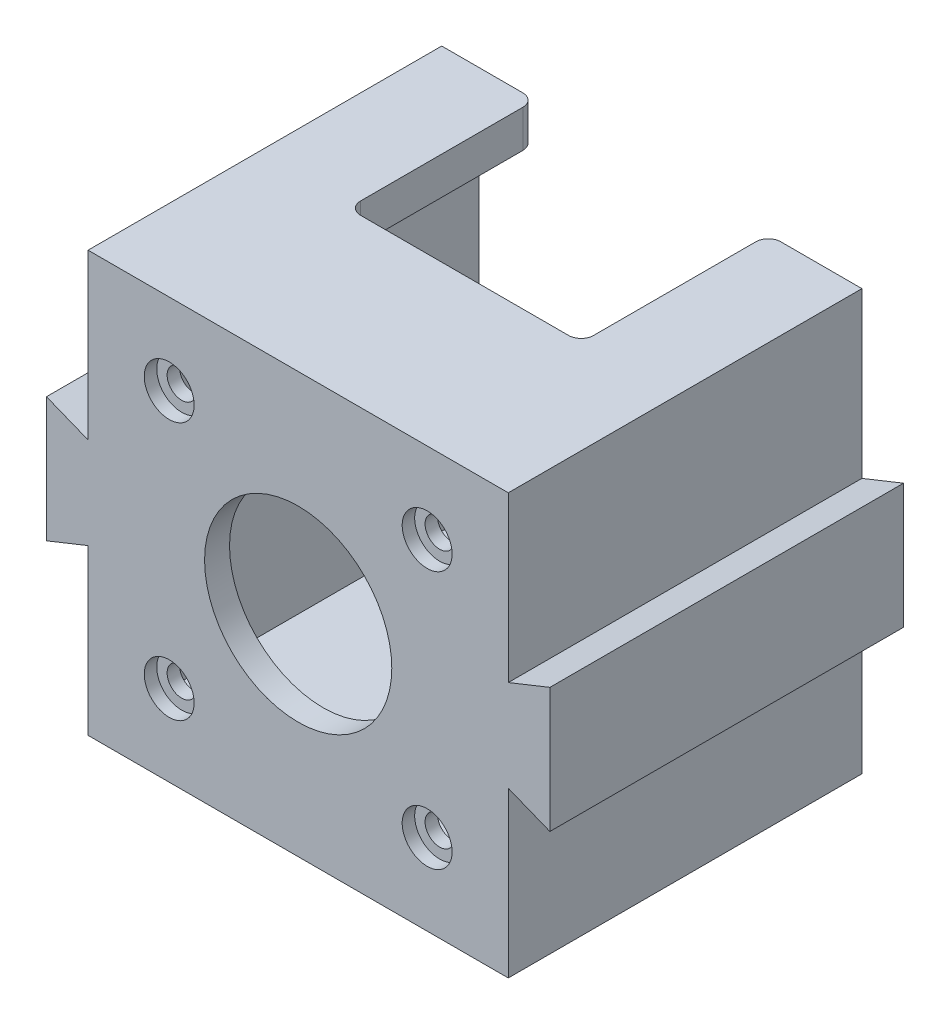
ISO-10303-21;
HEADER;
FILE_DESCRIPTION(('STEP AP214'),'2;1');
FILE_NAME('part.step','',(''),(''),'','','');
FILE_SCHEMA(('AUTOMOTIVE_DESIGN { 1 0 10303 214 1 1 1 1 }'));
ENDSEC;
DATA;
#1=APPLICATION_CONTEXT('core data for automotive mechanical design processes');
#2=APPLICATION_PROTOCOL_DEFINITION('international standard','automotive_design',2000,#1);
#3=PRODUCT_CONTEXT('',#1,'mechanical');
#4=PRODUCT('Part','Part','',(#3));
#5=PRODUCT_RELATED_PRODUCT_CATEGORY('part','',(#4));
#6=PRODUCT_DEFINITION_FORMATION('','',#4);
#7=PRODUCT_DEFINITION_CONTEXT('part definition',#1,'design');
#8=PRODUCT_DEFINITION('design','',#6,#7);
#9=PRODUCT_DEFINITION_SHAPE('','',#8);
#10=(LENGTH_UNIT() NAMED_UNIT(*) SI_UNIT(.MILLI.,.METRE.));
#11=(NAMED_UNIT(*) PLANE_ANGLE_UNIT() SI_UNIT($,.RADIAN.));
#12=(NAMED_UNIT(*) SI_UNIT($,.STERADIAN.) SOLID_ANGLE_UNIT());
#13=UNCERTAINTY_MEASURE_WITH_UNIT(LENGTH_MEASURE(1.E-05),#10,'distance_accuracy_value','');
#14=(GEOMETRIC_REPRESENTATION_CONTEXT(3) GLOBAL_UNCERTAINTY_ASSIGNED_CONTEXT((#13)) GLOBAL_UNIT_ASSIGNED_CONTEXT((#10,
#11,#12)) REPRESENTATION_CONTEXT('',''));
#15=CARTESIAN_POINT('',(0.,0.,0.));
#16=DIRECTION('',(0.,0.,1.));
#17=DIRECTION('',(1.,0.,0.));
#18=AXIS2_PLACEMENT_3D('',#15,#16,#17);
#19=CARTESIAN_POINT('',(-25.25,0.,3.));
#20=DIRECTION('',(1.,0.,0.));
#21=DIRECTION('',(0.,0.,-1.));
#22=AXIS2_PLACEMENT_3D('',#19,#20,#21);
#23=PLANE('',#22);
#24=DIRECTION('',(0.,0.,1.));
#25=VECTOR('',#24,1.);
#26=CARTESIAN_POINT('',(-25.25,-5.50000000000001,-55.3113883008419));
#27=LINE('',#26,#25);
#28=CARTESIAN_POINT('',(-25.25,-5.50000000000001,-39.5));
#29=VERTEX_POINT('',#28);
#30=CARTESIAN_POINT('',(-25.25,-5.50000000000001,3.));
#31=VERTEX_POINT('',#30);
#32=EDGE_CURVE('E68',#29,#31,#27,.T.);
#33=ORIENTED_EDGE('',*,*,#32,.F.);
#34=DIRECTION('',(0.,-1.,0.));
#35=VECTOR('',#34,1.);
#36=CARTESIAN_POINT('',(-25.25,0.,-39.5));
#37=LINE('',#36,#35);
#38=CARTESIAN_POINT('',(-25.25,-25.25,-39.5));
#39=VERTEX_POINT('',#38);
#40=EDGE_CURVE('E352',#29,#39,#37,.T.);
#41=ORIENTED_EDGE('',*,*,#40,.T.);
#42=DIRECTION('',(0.,0.,-1.));
#43=VECTOR('',#42,1.);
#44=CARTESIAN_POINT('',(-25.25,-25.25,3.));
#45=LINE('',#44,#43);
#46=CARTESIAN_POINT('',(-25.25,-25.25,3.));
#47=VERTEX_POINT('',#46);
#48=EDGE_CURVE('E391',#47,#39,#45,.T.);
#49=ORIENTED_EDGE('',*,*,#48,.F.);
#50=DIRECTION('',(0.,-1.,0.));
#51=VECTOR('',#50,1.);
#52=CARTESIAN_POINT('',(-25.25,0.,3.));
#53=LINE('',#52,#51);
#54=EDGE_CURVE('E369',#31,#47,#53,.T.);
#55=ORIENTED_EDGE('',*,*,#54,.F.);
#56=EDGE_LOOP('',(#33,#41,#49,#55));
#57=FACE_BOUND('',#56,.T.);
#58=ADVANCED_FACE('F43',(#57),#23,.F.);
#59=CARTESIAN_POINT('',(25.25,0.,3.));
#60=DIRECTION('',(1.,0.,0.));
#61=DIRECTION('',(0.,1.,0.));
#62=AXIS2_PLACEMENT_3D('',#59,#60,#61);
#63=PLANE('',#62);
#64=DIRECTION('',(0.,-1.,0.));
#65=VECTOR('',#64,1.);
#66=CARTESIAN_POINT('',(25.25,0.,-39.5));
#67=LINE('',#66,#65);
#68=CARTESIAN_POINT('',(25.25,-5.5,-39.5));
#69=VERTEX_POINT('',#68);
#70=CARTESIAN_POINT('',(25.25,-25.25,-39.5));
#71=VERTEX_POINT('',#70);
#72=EDGE_CURVE('E325',#69,#71,#67,.T.);
#73=ORIENTED_EDGE('',*,*,#72,.F.);
#74=DIRECTION('',(0.,0.,1.));
#75=VECTOR('',#74,1.);
#76=CARTESIAN_POINT('',(25.25,-5.5,-55.3113883008419));
#77=LINE('',#76,#75);
#78=CARTESIAN_POINT('',(25.25,-5.5,3.));
#79=VERTEX_POINT('',#78);
#80=EDGE_CURVE('E255',#69,#79,#77,.T.);
#81=ORIENTED_EDGE('',*,*,#80,.T.);
#82=DIRECTION('',(0.,-1.,0.));
#83=VECTOR('',#82,1.);
#84=CARTESIAN_POINT('',(25.25,0.,3.));
#85=LINE('',#84,#83);
#86=CARTESIAN_POINT('',(25.25,-25.25,3.));
#87=VERTEX_POINT('',#86);
#88=EDGE_CURVE('E362',#79,#87,#85,.T.);
#89=ORIENTED_EDGE('',*,*,#88,.T.);
#90=DIRECTION('',(0.,0.,-1.));
#91=VECTOR('',#90,1.);
#92=CARTESIAN_POINT('',(25.25,-25.25,3.));
#93=LINE('',#92,#91);
#94=EDGE_CURVE('E375',#87,#71,#93,.T.);
#95=ORIENTED_EDGE('',*,*,#94,.T.);
#96=EDGE_LOOP('',(#73,#81,#89,#95));
#97=FACE_BOUND('',#96,.T.);
#98=ADVANCED_FACE('F488',(#97),#63,.T.);
#99=CARTESIAN_POINT('',(-15.5,15.5,3.));
#100=DIRECTION('',(0.,0.,-1.));
#101=DIRECTION('',(-1.,0.,0.));
#102=AXIS2_PLACEMENT_3D('',#99,#100,#101);
#103=CYLINDRICAL_SURFACE('',#102,1.75);
#104=CARTESIAN_POINT('',(-15.5,15.5,0.));
#105=DIRECTION('',(0.,0.,1.));
#106=DIRECTION('',(1.,0.,0.));
#107=AXIS2_PLACEMENT_3D('',#104,#105,#106);
#108=CIRCLE('',#107,1.75);
#109=CARTESIAN_POINT('',(-13.75,15.5,0.));
#110=VERTEX_POINT('',#109);
#111=EDGE_CURVE('E384',#110,#110,#108,.T.);
#112=ORIENTED_EDGE('',*,*,#111,.F.);
#113=EDGE_LOOP('',(#112));
#114=FACE_BOUND('',#113,.T.);
#115=CARTESIAN_POINT('',(-15.5,15.5,1.5));
#116=DIRECTION('',(0.,0.,1.));
#117=DIRECTION('',(1.,0.,0.));
#118=AXIS2_PLACEMENT_3D('',#115,#116,#117);
#119=CIRCLE('',#118,1.75);
#120=CARTESIAN_POINT('',(-13.75,15.5,1.5));
#121=VERTEX_POINT('',#120);
#122=EDGE_CURVE('E47',#121,#121,#119,.T.);
#123=ORIENTED_EDGE('',*,*,#122,.T.);
#124=EDGE_LOOP('',(#123));
#125=FACE_BOUND('',#124,.T.);
#126=ADVANCED_FACE('F438',(#114,#125),#103,.F.);
#127=CARTESIAN_POINT('',(15.5,15.5,3.));
#128=DIRECTION('',(0.,0.,-1.));
#129=DIRECTION('',(-1.,0.,0.));
#130=AXIS2_PLACEMENT_3D('',#127,#128,#129);
#131=CYLINDRICAL_SURFACE('',#130,1.75);
#132=CARTESIAN_POINT('',(15.5,15.5,0.));
#133=DIRECTION('',(0.,0.,1.));
#134=DIRECTION('',(1.,0.,0.));
#135=AXIS2_PLACEMENT_3D('',#132,#133,#134);
#136=CIRCLE('',#135,1.75);
#137=CARTESIAN_POINT('',(17.25,15.5,0.));
#138=VERTEX_POINT('',#137);
#139=EDGE_CURVE('E381',#138,#138,#136,.T.);
#140=ORIENTED_EDGE('',*,*,#139,.F.);
#141=EDGE_LOOP('',(#140));
#142=FACE_BOUND('',#141,.T.);
#143=CARTESIAN_POINT('',(15.5,15.5,1.5));
#144=DIRECTION('',(0.,0.,1.));
#145=DIRECTION('',(1.,0.,0.));
#146=AXIS2_PLACEMENT_3D('',#143,#144,#145);
#147=CIRCLE('',#146,1.75);
#148=CARTESIAN_POINT('',(17.25,15.5,1.5));
#149=VERTEX_POINT('',#148);
#150=EDGE_CURVE('E431',#149,#149,#147,.T.);
#151=ORIENTED_EDGE('',*,*,#150,.T.);
#152=EDGE_LOOP('',(#151));
#153=FACE_BOUND('',#152,.T.);
#154=ADVANCED_FACE('F516',(#142,#153),#131,.F.);
#155=CARTESIAN_POINT('',(-15.5,-15.5,3.));
#156=DIRECTION('',(0.,0.,-1.));
#157=DIRECTION('',(-1.,0.,0.));
#158=AXIS2_PLACEMENT_3D('',#155,#156,#157);
#159=CYLINDRICAL_SURFACE('',#158,1.75);
#160=CARTESIAN_POINT('',(-15.5,-15.5,0.));
#161=DIRECTION('',(0.,0.,1.));
#162=DIRECTION('',(1.,0.,0.));
#163=AXIS2_PLACEMENT_3D('',#160,#161,#162);
#164=CIRCLE('',#163,1.75);
#165=CARTESIAN_POINT('',(-13.75,-15.5,0.));
#166=VERTEX_POINT('',#165);
#167=EDGE_CURVE('E378',#166,#166,#164,.T.);
#168=ORIENTED_EDGE('',*,*,#167,.F.);
#169=EDGE_LOOP('',(#168));
#170=FACE_BOUND('',#169,.T.);
#171=CARTESIAN_POINT('',(-15.5,-15.5,1.5));
#172=DIRECTION('',(0.,0.,1.));
#173=DIRECTION('',(1.,0.,0.));
#174=AXIS2_PLACEMENT_3D('',#171,#172,#173);
#175=CIRCLE('',#174,1.75);
#176=CARTESIAN_POINT('',(-13.75,-15.5,1.5));
#177=VERTEX_POINT('',#176);
#178=EDGE_CURVE('E429',#177,#177,#175,.T.);
#179=ORIENTED_EDGE('',*,*,#178,.T.);
#180=EDGE_LOOP('',(#179));
#181=FACE_BOUND('',#180,.T.);
#182=ADVANCED_FACE('F520',(#170,#181),#159,.F.);
#183=CARTESIAN_POINT('',(15.5,-15.5,3.));
#184=DIRECTION('',(0.,0.,-1.));
#185=DIRECTION('',(-1.,0.,0.));
#186=AXIS2_PLACEMENT_3D('',#183,#184,#185);
#187=CYLINDRICAL_SURFACE('',#186,1.75);
#188=CARTESIAN_POINT('',(15.5,-15.5,0.));
#189=DIRECTION('',(0.,0.,1.));
#190=DIRECTION('',(1.,0.,0.));
#191=AXIS2_PLACEMENT_3D('',#188,#189,#190);
#192=CIRCLE('',#191,1.75);
#193=CARTESIAN_POINT('',(17.25,-15.5,0.));
#194=VERTEX_POINT('',#193);
#195=EDGE_CURVE('E358',#194,#194,#192,.T.);
#196=ORIENTED_EDGE('',*,*,#195,.F.);
#197=EDGE_LOOP('',(#196));
#198=FACE_BOUND('',#197,.T.);
#199=CARTESIAN_POINT('',(15.5,-15.5,1.5));
#200=DIRECTION('',(0.,0.,1.));
#201=DIRECTION('',(1.,0.,0.));
#202=AXIS2_PLACEMENT_3D('',#199,#200,#201);
#203=CIRCLE('',#202,1.75);
#204=CARTESIAN_POINT('',(17.25,-15.5,1.5));
#205=VERTEX_POINT('',#204);
#206=EDGE_CURVE('E287',#205,#205,#203,.T.);
#207=ORIENTED_EDGE('',*,*,#206,.T.);
#208=EDGE_LOOP('',(#207));
#209=FACE_BOUND('',#208,.T.);
#210=ADVANCED_FACE('F524',(#198,#209),#187,.F.);
#211=CARTESIAN_POINT('',(0.,0.,0.));
#212=DIRECTION('',(0.,0.,1.));
#213=DIRECTION('',(1.,0.,0.));
#214=AXIS2_PLACEMENT_3D('',#211,#212,#213);
#215=PLANE('',#214);
#216=ORIENTED_EDGE('',*,*,#195,.T.);
#217=EDGE_LOOP('',(#216));
#218=FACE_BOUND('',#217,.T.);
#219=ORIENTED_EDGE('',*,*,#167,.T.);
#220=EDGE_LOOP('',(#219));
#221=FACE_BOUND('',#220,.T.);
#222=ORIENTED_EDGE('',*,*,#139,.T.);
#223=EDGE_LOOP('',(#222));
#224=FACE_BOUND('',#223,.T.);
#225=ORIENTED_EDGE('',*,*,#111,.T.);
#226=EDGE_LOOP('',(#225));
#227=FACE_BOUND('',#226,.T.);
#228=CARTESIAN_POINT('',(0.,0.,0.));
#229=DIRECTION('',(0.,0.,1.));
#230=DIRECTION('',(1.,0.,0.));
#231=AXIS2_PLACEMENT_3D('',#228,#229,#230);
#232=CIRCLE('',#231,11.25);
#233=CARTESIAN_POINT('',(11.25,0.,0.));
#234=VERTEX_POINT('',#233);
#235=EDGE_CURVE('E363',#234,#234,#232,.T.);
#236=ORIENTED_EDGE('',*,*,#235,.T.);
#237=EDGE_LOOP('',(#236));
#238=FACE_BOUND('',#237,.T.);
#239=DIRECTION('',(-1.,0.,0.));
#240=VECTOR('',#239,1.);
#241=CARTESIAN_POINT('',(0.,20.75,0.));
#242=LINE('',#241,#240);
#243=CARTESIAN_POINT('',(20.75,20.75,0.));
#244=VERTEX_POINT('',#243);
#245=CARTESIAN_POINT('',(-20.75,20.75,0.));
#246=VERTEX_POINT('',#245);
#247=EDGE_CURVE('E334',#244,#246,#242,.T.);
#248=ORIENTED_EDGE('',*,*,#247,.F.);
#249=DIRECTION('',(0.,1.,0.));
#250=VECTOR('',#249,1.);
#251=CARTESIAN_POINT('',(20.75,0.,0.));
#252=LINE('',#251,#250);
#253=CARTESIAN_POINT('',(20.75,-20.75,0.));
#254=VERTEX_POINT('',#253);
#255=EDGE_CURVE('E331',#254,#244,#252,.T.);
#256=ORIENTED_EDGE('',*,*,#255,.F.);
#257=DIRECTION('',(-1.,0.,0.));
#258=VECTOR('',#257,1.);
#259=CARTESIAN_POINT('',(0.,-20.75,0.));
#260=LINE('',#259,#258);
#261=CARTESIAN_POINT('',(-20.75,-20.75,0.));
#262=VERTEX_POINT('',#261);
#263=EDGE_CURVE('E328',#254,#262,#260,.T.);
#264=ORIENTED_EDGE('',*,*,#263,.T.);
#265=DIRECTION('',(0.,1.,0.));
#266=VECTOR('',#265,1.);
#267=CARTESIAN_POINT('',(-20.75,0.,0.));
#268=LINE('',#267,#266);
#269=EDGE_CURVE('E307',#262,#246,#268,.T.);
#270=ORIENTED_EDGE('',*,*,#269,.T.);
#271=EDGE_LOOP('',(#248,#256,#264,#270));
#272=FACE_BOUND('',#271,.T.);
#273=ADVANCED_FACE('F512',(#218,#221,#224,#227,#238,#272),#215,.F.);
#274=DIRECTION('',(0.,0.,1.));
#275=VECTOR('',#274,1.);
#276=CARTESIAN_POINT('',(25.25,5.5,-55.3113883008419));
#277=LINE('',#276,#275);
#278=CARTESIAN_POINT('',(25.25,5.5,-39.5));
#279=VERTEX_POINT('',#278);
#280=CARTESIAN_POINT('',(25.25,5.5,3.));
#281=VERTEX_POINT('',#280);
#282=EDGE_CURVE('E244',#279,#281,#277,.T.);
#283=ORIENTED_EDGE('',*,*,#282,.F.);
#284=CARTESIAN_POINT('',(25.25,25.25,-39.5));
#285=VERTEX_POINT('',#284);
#286=EDGE_CURVE('E345',#285,#279,#67,.T.);
#287=ORIENTED_EDGE('',*,*,#286,.F.);
#288=DIRECTION('',(0.,0.,-1.));
#289=VECTOR('',#288,1.);
#290=CARTESIAN_POINT('',(25.25,25.25,3.));
#291=LINE('',#290,#289);
#292=CARTESIAN_POINT('',(25.25,25.25,3.));
#293=VERTEX_POINT('',#292);
#294=EDGE_CURVE('E396',#293,#285,#291,.T.);
#295=ORIENTED_EDGE('',*,*,#294,.F.);
#296=EDGE_CURVE('E364',#293,#281,#85,.T.);
#297=ORIENTED_EDGE('',*,*,#296,.T.);
#298=EDGE_LOOP('',(#283,#287,#295,#297));
#299=FACE_BOUND('',#298,.T.);
#300=ADVANCED_FACE('F496',(#299),#63,.T.);
#301=CARTESIAN_POINT('',(0.,25.25,3.));
#302=DIRECTION('',(0.,1.,0.));
#303=DIRECTION('',(0.,0.,1.));
#304=AXIS2_PLACEMENT_3D('',#301,#302,#303);
#305=PLANE('',#304);
#306=DIRECTION('',(1.,0.,0.));
#307=VECTOR('',#306,1.);
#308=CARTESIAN_POINT('',(0.,25.25,-39.5));
#309=LINE('',#308,#307);
#310=CARTESIAN_POINT('',(15.5,25.25,-39.5));
#311=VERTEX_POINT('',#310);
#312=EDGE_CURVE('E348',#311,#285,#309,.T.);
#313=ORIENTED_EDGE('',*,*,#312,.F.);
#314=CARTESIAN_POINT('',(15.5,25.25,-38.));
#315=DIRECTION('',(0.,1.,0.));
#316=DIRECTION('',(0.,0.,1.));
#317=AXIS2_PLACEMENT_3D('',#314,#315,#316);
#318=CIRCLE('',#317,1.5);
#319=CARTESIAN_POINT('',(14.,25.25,-38.));
#320=VERTEX_POINT('',#319);
#321=EDGE_CURVE('E420',#311,#320,#318,.T.);
#322=ORIENTED_EDGE('',*,*,#321,.T.);
#323=DIRECTION('',(0.,0.,-1.));
#324=VECTOR('',#323,1.);
#325=CARTESIAN_POINT('',(14.,25.25,-39.5));
#326=LINE('',#325,#324);
#327=CARTESIAN_POINT('',(14.,25.25,-18.5));
#328=VERTEX_POINT('',#327);
#329=EDGE_CURVE('E301',#328,#320,#326,.T.);
#330=ORIENTED_EDGE('',*,*,#329,.F.);
#331=CARTESIAN_POINT('',(12.5,25.25,-18.5));
#332=DIRECTION('',(0.,1.,0.));
#333=DIRECTION('',(0.,0.,1.));
#334=AXIS2_PLACEMENT_3D('',#331,#332,#333);
#335=CIRCLE('',#334,1.5);
#336=CARTESIAN_POINT('',(12.5,25.25,-17.));
#337=VERTEX_POINT('',#336);
#338=EDGE_CURVE('E298',#337,#328,#335,.T.);
#339=ORIENTED_EDGE('',*,*,#338,.F.);
#340=DIRECTION('',(1.,0.,0.));
#341=VECTOR('',#340,1.);
#342=CARTESIAN_POINT('',(-12.5,25.25,-17.));
#343=LINE('',#342,#341);
#344=CARTESIAN_POINT('',(-12.5,25.25,-17.));
#345=VERTEX_POINT('',#344);
#346=EDGE_CURVE('E295',#345,#337,#343,.T.);
#347=ORIENTED_EDGE('',*,*,#346,.F.);
#348=CARTESIAN_POINT('',(-12.5,25.25,-18.5));
#349=DIRECTION('',(0.,1.,0.));
#350=DIRECTION('',(0.,0.,1.));
#351=AXIS2_PLACEMENT_3D('',#348,#349,#350);
#352=CIRCLE('',#351,1.5);
#353=CARTESIAN_POINT('',(-14.,25.25,-18.5));
#354=VERTEX_POINT('',#353);
#355=EDGE_CURVE('E292',#354,#345,#352,.T.);
#356=ORIENTED_EDGE('',*,*,#355,.F.);
#357=DIRECTION('',(0.,0.,1.));
#358=VECTOR('',#357,1.);
#359=CARTESIAN_POINT('',(-14.,25.25,-39.5));
#360=LINE('',#359,#358);
#361=CARTESIAN_POINT('',(-14.,25.25,-38.));
#362=VERTEX_POINT('',#361);
#363=EDGE_CURVE('E290',#362,#354,#360,.T.);
#364=ORIENTED_EDGE('',*,*,#363,.F.);
#365=CARTESIAN_POINT('',(-15.5,25.25,-38.));
#366=DIRECTION('',(0.,1.,0.));
#367=DIRECTION('',(0.,0.,1.));
#368=AXIS2_PLACEMENT_3D('',#365,#366,#367);
#369=CIRCLE('',#368,1.5);
#370=CARTESIAN_POINT('',(-15.5,25.25,-39.5));
#371=VERTEX_POINT('',#370);
#372=EDGE_CURVE('E418',#362,#371,#369,.T.);
#373=ORIENTED_EDGE('',*,*,#372,.T.);
#374=CARTESIAN_POINT('',(-25.25,25.25,-39.5));
#375=VERTEX_POINT('',#374);
#376=EDGE_CURVE('E349',#375,#371,#309,.T.);
#377=ORIENTED_EDGE('',*,*,#376,.F.);
#378=DIRECTION('',(0.,0.,-1.));
#379=VECTOR('',#378,1.);
#380=CARTESIAN_POINT('',(-25.25,25.25,3.));
#381=LINE('',#380,#379);
#382=CARTESIAN_POINT('',(-25.25,25.25,3.));
#383=VERTEX_POINT('',#382);
#384=EDGE_CURVE('E394',#383,#375,#381,.T.);
#385=ORIENTED_EDGE('',*,*,#384,.F.);
#386=DIRECTION('',(1.,0.,0.));
#387=VECTOR('',#386,1.);
#388=CARTESIAN_POINT('',(0.,25.25,3.));
#389=LINE('',#388,#387);
#390=EDGE_CURVE('E366',#383,#293,#389,.T.);
#391=ORIENTED_EDGE('',*,*,#390,.T.);
#392=ORIENTED_EDGE('',*,*,#294,.T.);
#393=EDGE_LOOP('',(#313,#322,#330,#339,#347,#356,#364,#373,#377,#385,#391,#392));
#394=FACE_BOUND('',#393,.T.);
#395=ADVANCED_FACE('F470',(#394),#305,.T.);
#396=CARTESIAN_POINT('',(-25.25,5.5,-39.5));
#397=VERTEX_POINT('',#396);
#398=EDGE_CURVE('E353',#375,#397,#37,.T.);
#399=ORIENTED_EDGE('',*,*,#398,.T.);
#400=DIRECTION('',(0.,0.,1.));
#401=VECTOR('',#400,1.);
#402=CARTESIAN_POINT('',(-25.25,5.5,-55.3113883008419));
#403=LINE('',#402,#401);
#404=CARTESIAN_POINT('',(-25.25,5.5,3.));
#405=VERTEX_POINT('',#404);
#406=EDGE_CURVE('E60',#397,#405,#403,.T.);
#407=ORIENTED_EDGE('',*,*,#406,.T.);
#408=EDGE_CURVE('E370',#383,#405,#53,.T.);
#409=ORIENTED_EDGE('',*,*,#408,.F.);
#410=ORIENTED_EDGE('',*,*,#384,.T.);
#411=EDGE_LOOP('',(#399,#407,#409,#410));
#412=FACE_BOUND('',#411,.T.);
#413=ADVANCED_FACE('F473',(#412),#23,.F.);
#414=CARTESIAN_POINT('',(0.,0.,3.));
#415=DIRECTION('',(0.,0.,-1.));
#416=DIRECTION('',(-1.,0.,0.));
#417=AXIS2_PLACEMENT_3D('',#414,#415,#416);
#418=CYLINDRICAL_SURFACE('',#417,11.25);
#419=CARTESIAN_POINT('',(0.,0.,3.));
#420=DIRECTION('',(0.,0.,1.));
#421=DIRECTION('',(1.,0.,0.));
#422=AXIS2_PLACEMENT_3D('',#419,#420,#421);
#423=CIRCLE('',#422,11.25);
#424=CARTESIAN_POINT('',(11.25,0.,3.));
#425=VERTEX_POINT('',#424);
#426=EDGE_CURVE('E359',#425,#425,#423,.T.);
#427=ORIENTED_EDGE('',*,*,#426,.T.);
#428=EDGE_LOOP('',(#427));
#429=FACE_BOUND('',#428,.T.);
#430=ORIENTED_EDGE('',*,*,#235,.F.);
#431=EDGE_LOOP('',(#430));
#432=FACE_BOUND('',#431,.T.);
#433=ADVANCED_FACE('F500',(#429,#432),#418,.F.);
#434=CARTESIAN_POINT('',(0.,-25.25,3.));
#435=DIRECTION('',(0.,1.,0.));
#436=DIRECTION('',(0.,0.,1.));
#437=AXIS2_PLACEMENT_3D('',#434,#435,#436);
#438=PLANE('',#437);
#439=ORIENTED_EDGE('',*,*,#48,.T.);
#440=DIRECTION('',(1.,0.,0.));
#441=VECTOR('',#440,1.);
#442=CARTESIAN_POINT('',(0.,-25.25,-39.5));
#443=LINE('',#442,#441);
#444=EDGE_CURVE('E355',#39,#71,#443,.T.);
#445=ORIENTED_EDGE('',*,*,#444,.T.);
#446=ORIENTED_EDGE('',*,*,#94,.F.);
#447=DIRECTION('',(1.,0.,0.));
#448=VECTOR('',#447,1.);
#449=CARTESIAN_POINT('',(0.,-25.25,3.));
#450=LINE('',#449,#448);
#451=EDGE_CURVE('E372',#47,#87,#450,.T.);
#452=ORIENTED_EDGE('',*,*,#451,.F.);
#453=EDGE_LOOP('',(#439,#445,#446,#452));
#454=FACE_BOUND('',#453,.T.);
#455=ADVANCED_FACE('F457',(#454),#438,.F.);
#456=CARTESIAN_POINT('',(0.,0.,3.));
#457=DIRECTION('',(0.,0.,1.));
#458=DIRECTION('',(1.,0.,0.));
#459=AXIS2_PLACEMENT_3D('',#456,#457,#458);
#460=PLANE('',#459);
#461=CARTESIAN_POINT('',(15.5,-15.5,3.));
#462=DIRECTION('',(0.,0.,1.));
#463=DIRECTION('',(1.,0.,0.));
#464=AXIS2_PLACEMENT_3D('',#461,#462,#463);
#465=CIRCLE('',#464,3.);
#466=CARTESIAN_POINT('',(18.5,-15.5,3.));
#467=VERTEX_POINT('',#466);
#468=EDGE_CURVE('E279',#467,#467,#465,.T.);
#469=ORIENTED_EDGE('',*,*,#468,.F.);
#470=EDGE_LOOP('',(#469));
#471=FACE_BOUND('',#470,.T.);
#472=CARTESIAN_POINT('',(-15.5,-15.5,3.));
#473=DIRECTION('',(0.,0.,1.));
#474=DIRECTION('',(1.,0.,0.));
#475=AXIS2_PLACEMENT_3D('',#472,#473,#474);
#476=CIRCLE('',#475,3.);
#477=CARTESIAN_POINT('',(-12.5,-15.5,3.));
#478=VERTEX_POINT('',#477);
#479=EDGE_CURVE('E273',#478,#478,#476,.T.);
#480=ORIENTED_EDGE('',*,*,#479,.F.);
#481=EDGE_LOOP('',(#480));
#482=FACE_BOUND('',#481,.T.);
#483=CARTESIAN_POINT('',(-15.5,15.5,3.));
#484=DIRECTION('',(0.,0.,1.));
#485=DIRECTION('',(1.,0.,0.));
#486=AXIS2_PLACEMENT_3D('',#483,#484,#485);
#487=CIRCLE('',#486,3.);
#488=CARTESIAN_POINT('',(-12.5,15.5,3.));
#489=VERTEX_POINT('',#488);
#490=EDGE_CURVE('E266',#489,#489,#487,.T.);
#491=ORIENTED_EDGE('',*,*,#490,.F.);
#492=EDGE_LOOP('',(#491));
#493=FACE_BOUND('',#492,.T.);
#494=CARTESIAN_POINT('',(15.5,15.5,3.));
#495=DIRECTION('',(0.,0.,1.));
#496=DIRECTION('',(1.,0.,0.));
#497=AXIS2_PLACEMENT_3D('',#494,#495,#496);
#498=CIRCLE('',#497,3.);
#499=CARTESIAN_POINT('',(18.5,15.5,3.));
#500=VERTEX_POINT('',#499);
#501=EDGE_CURVE('E269',#500,#500,#498,.T.);
#502=ORIENTED_EDGE('',*,*,#501,.F.);
#503=EDGE_LOOP('',(#502));
#504=FACE_BOUND('',#503,.T.);
#505=ORIENTED_EDGE('',*,*,#426,.F.);
#506=EDGE_LOOP('',(#505));
#507=FACE_BOUND('',#506,.T.);
#508=ORIENTED_EDGE('',*,*,#296,.F.);
#509=ORIENTED_EDGE('',*,*,#390,.F.);
#510=ORIENTED_EDGE('',*,*,#408,.T.);
#511=DIRECTION('',(-0.92847669088526,0.371390676354102,0.));
#512=VECTOR('',#511,1.);
#513=CARTESIAN_POINT('',(-25.25,5.5,3.));
#514=LINE('',#513,#512);
#515=CARTESIAN_POINT('',(-30.25,7.49999999999999,3.));
#516=VERTEX_POINT('',#515);
#517=EDGE_CURVE('E233',#405,#516,#514,.T.);
#518=ORIENTED_EDGE('',*,*,#517,.T.);
#519=DIRECTION('',(0.,-1.,0.));
#520=VECTOR('',#519,1.);
#521=CARTESIAN_POINT('',(-30.25,7.49999999999999,3.));
#522=LINE('',#521,#520);
#523=CARTESIAN_POINT('',(-30.25,-7.50000000000001,3.));
#524=VERTEX_POINT('',#523);
#525=EDGE_CURVE('E227',#516,#524,#522,.T.);
#526=ORIENTED_EDGE('',*,*,#525,.T.);
#527=DIRECTION('',(0.928476690885259,0.371390676354104,0.));
#528=VECTOR('',#527,1.);
#529=CARTESIAN_POINT('',(-30.25,-7.50000000000001,3.));
#530=LINE('',#529,#528);
#531=EDGE_CURVE('E235',#524,#31,#530,.T.);
#532=ORIENTED_EDGE('',*,*,#531,.T.);
#533=ORIENTED_EDGE('',*,*,#54,.T.);
#534=ORIENTED_EDGE('',*,*,#451,.T.);
#535=ORIENTED_EDGE('',*,*,#88,.F.);
#536=DIRECTION('',(0.928476690885259,-0.371390676354104,0.));
#537=VECTOR('',#536,1.);
#538=CARTESIAN_POINT('',(30.25,-7.5,3.));
#539=LINE('',#538,#537);
#540=CARTESIAN_POINT('',(30.25,-7.5,3.));
#541=VERTEX_POINT('',#540);
#542=EDGE_CURVE('E239',#79,#541,#539,.T.);
#543=ORIENTED_EDGE('',*,*,#542,.T.);
#544=DIRECTION('',(0.,1.,0.));
#545=VECTOR('',#544,1.);
#546=CARTESIAN_POINT('',(30.25,7.5,3.));
#547=LINE('',#546,#545);
#548=CARTESIAN_POINT('',(30.25,7.5,3.));
#549=VERTEX_POINT('',#548);
#550=EDGE_CURVE('E249',#541,#549,#547,.T.);
#551=ORIENTED_EDGE('',*,*,#550,.T.);
#552=DIRECTION('',(-0.92847669088526,-0.371390676354102,0.));
#553=VECTOR('',#552,1.);
#554=CARTESIAN_POINT('',(25.25,5.5,3.));
#555=LINE('',#554,#553);
#556=EDGE_CURVE('E252',#549,#281,#555,.T.);
#557=ORIENTED_EDGE('',*,*,#556,.T.);
#558=EDGE_LOOP('',(#508,#509,#510,#518,#526,#532,#533,#534,#535,#543,#551,#557));
#559=FACE_BOUND('',#558,.T.);
#560=ADVANCED_FACE('F454',(#471,#482,#493,#504,#507,#559),#460,.T.);
#561=CARTESIAN_POINT('',(0.,0.,-39.5));
#562=DIRECTION('',(0.,0.,1.));
#563=DIRECTION('',(1.,0.,0.));
#564=AXIS2_PLACEMENT_3D('',#561,#562,#563);
#565=PLANE('',#564);
#566=DIRECTION('',(1.,0.,0.));
#567=VECTOR('',#566,1.);
#568=CARTESIAN_POINT('',(0.,20.75,-39.5));
#569=LINE('',#568,#567);
#570=CARTESIAN_POINT('',(15.5,20.75,-39.5));
#571=VERTEX_POINT('',#570);
#572=CARTESIAN_POINT('',(20.75,20.75,-39.5));
#573=VERTEX_POINT('',#572);
#574=EDGE_CURVE('E318',#571,#573,#569,.T.);
#575=ORIENTED_EDGE('',*,*,#574,.F.);
#576=DIRECTION('',(0.,1.,0.));
#577=VECTOR('',#576,1.);
#578=CARTESIAN_POINT('',(15.5,0.,-39.5));
#579=LINE('',#578,#577);
#580=EDGE_CURVE('E415',#571,#311,#579,.T.);
#581=ORIENTED_EDGE('',*,*,#580,.T.);
#582=ORIENTED_EDGE('',*,*,#312,.T.);
#583=ORIENTED_EDGE('',*,*,#286,.T.);
#584=DIRECTION('',(0.92847669088526,0.371390676354102,0.));
#585=VECTOR('',#584,1.);
#586=CARTESIAN_POINT('',(25.25,5.5,-39.5));
#587=LINE('',#586,#585);
#588=CARTESIAN_POINT('',(30.25,7.5,-39.5));
#589=VERTEX_POINT('',#588);
#590=EDGE_CURVE('E243',#279,#589,#587,.T.);
#591=ORIENTED_EDGE('',*,*,#590,.T.);
#592=DIRECTION('',(0.,-1.,0.));
#593=VECTOR('',#592,1.);
#594=CARTESIAN_POINT('',(30.25,7.5,-39.5));
#595=LINE('',#594,#593);
#596=CARTESIAN_POINT('',(30.25,-7.5,-39.5));
#597=VERTEX_POINT('',#596);
#598=EDGE_CURVE('E241',#589,#597,#595,.T.);
#599=ORIENTED_EDGE('',*,*,#598,.T.);
#600=DIRECTION('',(-0.928476690885259,0.371390676354104,0.));
#601=VECTOR('',#600,1.);
#602=CARTESIAN_POINT('',(30.25,-7.5,-39.5));
#603=LINE('',#602,#601);
#604=EDGE_CURVE('E246',#597,#69,#603,.T.);
#605=ORIENTED_EDGE('',*,*,#604,.T.);
#606=ORIENTED_EDGE('',*,*,#72,.T.);
#607=ORIENTED_EDGE('',*,*,#444,.F.);
#608=ORIENTED_EDGE('',*,*,#40,.F.);
#609=DIRECTION('',(-0.928476690885259,-0.371390676354104,0.));
#610=VECTOR('',#609,1.);
#611=CARTESIAN_POINT('',(-30.25,-7.50000000000001,-39.5));
#612=LINE('',#611,#610);
#613=CARTESIAN_POINT('',(-30.25,-7.50000000000001,-39.5));
#614=VERTEX_POINT('',#613);
#615=EDGE_CURVE('E214',#29,#614,#612,.T.);
#616=ORIENTED_EDGE('',*,*,#615,.T.);
#617=DIRECTION('',(0.,1.,0.));
#618=VECTOR('',#617,1.);
#619=CARTESIAN_POINT('',(-30.25,7.49999999999999,-39.5));
#620=LINE('',#619,#618);
#621=CARTESIAN_POINT('',(-30.25,7.49999999999999,-39.5));
#622=VERTEX_POINT('',#621);
#623=EDGE_CURVE('E207',#614,#622,#620,.T.);
#624=ORIENTED_EDGE('',*,*,#623,.T.);
#625=DIRECTION('',(0.92847669088526,-0.371390676354102,0.));
#626=VECTOR('',#625,1.);
#627=CARTESIAN_POINT('',(-25.25,5.5,-39.5));
#628=LINE('',#627,#626);
#629=EDGE_CURVE('E212',#622,#397,#628,.T.);
#630=ORIENTED_EDGE('',*,*,#629,.T.);
#631=ORIENTED_EDGE('',*,*,#398,.F.);
#632=ORIENTED_EDGE('',*,*,#376,.T.);
#633=DIRECTION('',(0.,1.,0.));
#634=VECTOR('',#633,1.);
#635=CARTESIAN_POINT('',(-15.5,0.,-39.5));
#636=LINE('',#635,#634);
#637=CARTESIAN_POINT('',(-15.5,20.75,-39.5));
#638=VERTEX_POINT('',#637);
#639=EDGE_CURVE('E413',#371,#638,#636,.F.);
#640=ORIENTED_EDGE('',*,*,#639,.T.);
#641=CARTESIAN_POINT('',(-20.75,20.75,-39.5));
#642=VERTEX_POINT('',#641);
#643=EDGE_CURVE('E314',#642,#638,#569,.T.);
#644=ORIENTED_EDGE('',*,*,#643,.F.);
#645=DIRECTION('',(0.,-1.,0.));
#646=VECTOR('',#645,1.);
#647=CARTESIAN_POINT('',(-20.75,0.,-39.5));
#648=LINE('',#647,#646);
#649=CARTESIAN_POINT('',(-20.75,-20.75,-39.5));
#650=VERTEX_POINT('',#649);
#651=EDGE_CURVE('E323',#642,#650,#648,.T.);
#652=ORIENTED_EDGE('',*,*,#651,.T.);
#653=DIRECTION('',(1.,0.,0.));
#654=VECTOR('',#653,1.);
#655=CARTESIAN_POINT('',(0.,-20.75,-39.5));
#656=LINE('',#655,#654);
#657=CARTESIAN_POINT('',(20.75,-20.75,-39.5));
#658=VERTEX_POINT('',#657);
#659=EDGE_CURVE('E321',#650,#658,#656,.T.);
#660=ORIENTED_EDGE('',*,*,#659,.T.);
#661=DIRECTION('',(0.,-1.,0.));
#662=VECTOR('',#661,1.);
#663=CARTESIAN_POINT('',(20.75,0.,-39.5));
#664=LINE('',#663,#662);
#665=EDGE_CURVE('E317',#573,#658,#664,.T.);
#666=ORIENTED_EDGE('',*,*,#665,.F.);
#667=EDGE_LOOP('',(#575,#581,#582,#583,#591,#599,#605,#606,#607,#608,#616,#624,#630,#631,#632,
#640,#644,#652,#660,#666));
#668=FACE_BOUND('',#667,.T.);
#669=ADVANCED_FACE('F210',(#668),#565,.F.);
#670=CARTESIAN_POINT('',(0.,20.75,-99.6040764008565));
#671=DIRECTION('',(0.,1.,0.));
#672=DIRECTION('',(0.,0.,1.));
#673=AXIS2_PLACEMENT_3D('',#670,#671,#672);
#674=PLANE('',#673);
#675=DIRECTION('',(0.,0.,-1.));
#676=VECTOR('',#675,1.);
#677=CARTESIAN_POINT('',(14.,20.75,-99.6040764008565));
#678=LINE('',#677,#676);
#679=CARTESIAN_POINT('',(14.,20.75,-18.5));
#680=VERTEX_POINT('',#679);
#681=CARTESIAN_POINT('',(14.,20.75,-38.));
#682=VERTEX_POINT('',#681);
#683=EDGE_CURVE('E408',#680,#682,#678,.T.);
#684=ORIENTED_EDGE('',*,*,#683,.T.);
#685=CARTESIAN_POINT('',(15.5,20.75,-38.));
#686=DIRECTION('',(0.,1.,0.));
#687=DIRECTION('',(0.,0.,1.));
#688=AXIS2_PLACEMENT_3D('',#685,#686,#687);
#689=CIRCLE('',#688,1.5);
#690=EDGE_CURVE('E52',#682,#571,#689,.F.);
#691=ORIENTED_EDGE('',*,*,#690,.T.);
#692=ORIENTED_EDGE('',*,*,#574,.T.);
#693=DIRECTION('',(0.,0.,1.));
#694=VECTOR('',#693,1.);
#695=CARTESIAN_POINT('',(20.75,20.75,-99.6040764008565));
#696=LINE('',#695,#694);
#697=EDGE_CURVE('E339',#573,#244,#696,.T.);
#698=ORIENTED_EDGE('',*,*,#697,.T.);
#699=ORIENTED_EDGE('',*,*,#247,.T.);
#700=DIRECTION('',(0.,0.,1.));
#701=VECTOR('',#700,1.);
#702=CARTESIAN_POINT('',(-20.75,20.75,-99.6040764008565));
#703=LINE('',#702,#701);
#704=EDGE_CURVE('E336',#642,#246,#703,.T.);
#705=ORIENTED_EDGE('',*,*,#704,.F.);
#706=ORIENTED_EDGE('',*,*,#643,.T.);
#707=CARTESIAN_POINT('',(-15.5,20.75,-38.));
#708=DIRECTION('',(0.,1.,0.));
#709=DIRECTION('',(0.,0.,1.));
#710=AXIS2_PLACEMENT_3D('',#707,#708,#709);
#711=CIRCLE('',#710,1.5);
#712=CARTESIAN_POINT('',(-14.,20.75,-38.));
#713=VERTEX_POINT('',#712);
#714=EDGE_CURVE('E424',#638,#713,#711,.F.);
#715=ORIENTED_EDGE('',*,*,#714,.T.);
#716=DIRECTION('',(0.,0.,1.));
#717=VECTOR('',#716,1.);
#718=CARTESIAN_POINT('',(-14.,20.75,-99.6040764008565));
#719=LINE('',#718,#717);
#720=CARTESIAN_POINT('',(-14.,20.75,-18.5));
#721=VERTEX_POINT('',#720);
#722=EDGE_CURVE('E411',#713,#721,#719,.T.);
#723=ORIENTED_EDGE('',*,*,#722,.T.);
#724=CARTESIAN_POINT('',(-12.5,20.75,-18.5));
#725=DIRECTION('',(0.,1.,0.));
#726=DIRECTION('',(0.,0.,1.));
#727=AXIS2_PLACEMENT_3D('',#724,#725,#726);
#728=CIRCLE('',#727,1.5);
#729=CARTESIAN_POINT('',(-12.5,20.75,-17.));
#730=VERTEX_POINT('',#729);
#731=EDGE_CURVE('E399',#721,#730,#728,.T.);
#732=ORIENTED_EDGE('',*,*,#731,.T.);
#733=DIRECTION('',(1.,0.,0.));
#734=VECTOR('',#733,1.);
#735=CARTESIAN_POINT('',(0.,20.75,-17.));
#736=LINE('',#735,#734);
#737=CARTESIAN_POINT('',(12.5,20.75,-17.));
#738=VERTEX_POINT('',#737);
#739=EDGE_CURVE('E402',#730,#738,#736,.T.);
#740=ORIENTED_EDGE('',*,*,#739,.T.);
#741=CARTESIAN_POINT('',(12.5,20.75,-18.5));
#742=DIRECTION('',(0.,1.,0.));
#743=DIRECTION('',(0.,0.,1.));
#744=AXIS2_PLACEMENT_3D('',#741,#742,#743);
#745=CIRCLE('',#744,1.5);
#746=EDGE_CURVE('E405',#738,#680,#745,.T.);
#747=ORIENTED_EDGE('',*,*,#746,.T.);
#748=EDGE_LOOP('',(#684,#691,#692,#698,#699,#705,#706,#715,#723,#732,#740,#747));
#749=FACE_BOUND('',#748,.T.);
#750=ADVANCED_FACE('F545',(#749),#674,.F.);
#751=CARTESIAN_POINT('',(20.75,0.,-99.6040764008565));
#752=DIRECTION('',(1.,0.,0.));
#753=DIRECTION('',(0.,0.,-1.));
#754=AXIS2_PLACEMENT_3D('',#751,#752,#753);
#755=PLANE('',#754);
#756=ORIENTED_EDGE('',*,*,#697,.F.);
#757=ORIENTED_EDGE('',*,*,#665,.T.);
#758=DIRECTION('',(0.,0.,1.));
#759=VECTOR('',#758,1.);
#760=CARTESIAN_POINT('',(20.75,-20.75,-99.6040764008565));
#761=LINE('',#760,#759);
#762=EDGE_CURVE('E341',#658,#254,#761,.T.);
#763=ORIENTED_EDGE('',*,*,#762,.T.);
#764=ORIENTED_EDGE('',*,*,#255,.T.);
#765=EDGE_LOOP('',(#756,#757,#763,#764));
#766=FACE_BOUND('',#765,.T.);
#767=ADVANCED_FACE('F551',(#766),#755,.F.);
#768=CARTESIAN_POINT('',(0.,-20.75,-99.6040764008565));
#769=DIRECTION('',(0.,1.,0.));
#770=DIRECTION('',(0.,0.,1.));
#771=AXIS2_PLACEMENT_3D('',#768,#769,#770);
#772=PLANE('',#771);
#773=ORIENTED_EDGE('',*,*,#659,.F.);
#774=DIRECTION('',(0.,0.,1.));
#775=VECTOR('',#774,1.);
#776=CARTESIAN_POINT('',(-20.75,-20.75,-99.6040764008565));
#777=LINE('',#776,#775);
#778=EDGE_CURVE('E343',#650,#262,#777,.T.);
#779=ORIENTED_EDGE('',*,*,#778,.T.);
#780=ORIENTED_EDGE('',*,*,#263,.F.);
#781=ORIENTED_EDGE('',*,*,#762,.F.);
#782=EDGE_LOOP('',(#773,#779,#780,#781));
#783=FACE_BOUND('',#782,.T.);
#784=ADVANCED_FACE('F563',(#783),#772,.T.);
#785=CARTESIAN_POINT('',(-20.75,0.,-99.6040764008565));
#786=DIRECTION('',(1.,0.,0.));
#787=DIRECTION('',(0.,0.,-1.));
#788=AXIS2_PLACEMENT_3D('',#785,#786,#787);
#789=PLANE('',#788);
#790=ORIENTED_EDGE('',*,*,#651,.F.);
#791=ORIENTED_EDGE('',*,*,#704,.T.);
#792=ORIENTED_EDGE('',*,*,#269,.F.);
#793=ORIENTED_EDGE('',*,*,#778,.F.);
#794=EDGE_LOOP('',(#790,#791,#792,#793));
#795=FACE_BOUND('',#794,.T.);
#796=ADVANCED_FACE('F559',(#795),#789,.T.);
#797=CARTESIAN_POINT('',(-14.,5.25,-39.5));
#798=DIRECTION('',(-1.,0.,0.));
#799=DIRECTION('',(0.,0.,1.));
#800=AXIS2_PLACEMENT_3D('',#797,#798,#799);
#801=PLANE('',#800);
#802=ORIENTED_EDGE('',*,*,#722,.F.);
#803=DIRECTION('',(0.,1.,0.));
#804=VECTOR('',#803,1.);
#805=CARTESIAN_POINT('',(-14.,5.25,-38.));
#806=LINE('',#805,#804);
#807=EDGE_CURVE('E11',#713,#362,#806,.T.);
#808=ORIENTED_EDGE('',*,*,#807,.T.);
#809=ORIENTED_EDGE('',*,*,#363,.T.);
#810=DIRECTION('',(0.,1.,0.));
#811=VECTOR('',#810,1.);
#812=CARTESIAN_POINT('',(-14.,5.25,-18.5));
#813=LINE('',#812,#811);
#814=EDGE_CURVE('E304',#721,#354,#813,.T.);
#815=ORIENTED_EDGE('',*,*,#814,.F.);
#816=EDGE_LOOP('',(#802,#808,#809,#815));
#817=FACE_BOUND('',#816,.T.);
#818=ADVANCED_FACE('F570',(#817),#801,.F.);
#819=CARTESIAN_POINT('',(14.,5.25,-39.5));
#820=DIRECTION('',(1.,0.,0.));
#821=DIRECTION('',(0.,0.,-1.));
#822=AXIS2_PLACEMENT_3D('',#819,#820,#821);
#823=PLANE('',#822);
#824=ORIENTED_EDGE('',*,*,#329,.T.);
#825=DIRECTION('',(0.,1.,0.));
#826=VECTOR('',#825,1.);
#827=CARTESIAN_POINT('',(14.,5.25,-38.));
#828=LINE('',#827,#826);
#829=EDGE_CURVE('E422',#320,#682,#828,.F.);
#830=ORIENTED_EDGE('',*,*,#829,.T.);
#831=ORIENTED_EDGE('',*,*,#683,.F.);
#832=DIRECTION('',(0.,1.,0.));
#833=VECTOR('',#832,1.);
#834=CARTESIAN_POINT('',(14.,5.25,-18.5));
#835=LINE('',#834,#833);
#836=EDGE_CURVE('E305',#680,#328,#835,.T.);
#837=ORIENTED_EDGE('',*,*,#836,.T.);
#838=EDGE_LOOP('',(#824,#830,#831,#837));
#839=FACE_BOUND('',#838,.T.);
#840=ADVANCED_FACE('F604',(#839),#823,.F.);
#841=CARTESIAN_POINT('',(12.5,5.25,-18.5));
#842=DIRECTION('',(0.,1.,0.));
#843=DIRECTION('',(0.,0.,1.));
#844=AXIS2_PLACEMENT_3D('',#841,#842,#843);
#845=CYLINDRICAL_SURFACE('',#844,1.5);
#846=DIRECTION('',(0.,1.,0.));
#847=VECTOR('',#846,1.);
#848=CARTESIAN_POINT('',(12.5,5.25,-17.));
#849=LINE('',#848,#847);
#850=EDGE_CURVE('E308',#738,#337,#849,.T.);
#851=ORIENTED_EDGE('',*,*,#850,.T.);
#852=ORIENTED_EDGE('',*,*,#338,.T.);
#853=ORIENTED_EDGE('',*,*,#836,.F.);
#854=ORIENTED_EDGE('',*,*,#746,.F.);
#855=EDGE_LOOP('',(#851,#852,#853,#854));
#856=FACE_BOUND('',#855,.T.);
#857=ADVANCED_FACE('F607',(#856),#845,.F.);
#858=CARTESIAN_POINT('',(-12.5,5.25,-17.));
#859=DIRECTION('',(0.,0.,1.));
#860=DIRECTION('',(1.,0.,0.));
#861=AXIS2_PLACEMENT_3D('',#858,#859,#860);
#862=PLANE('',#861);
#863=DIRECTION('',(0.,1.,0.));
#864=VECTOR('',#863,1.);
#865=CARTESIAN_POINT('',(-12.5,5.25,-17.));
#866=LINE('',#865,#864);
#867=EDGE_CURVE('E310',#730,#345,#866,.T.);
#868=ORIENTED_EDGE('',*,*,#867,.T.);
#869=ORIENTED_EDGE('',*,*,#346,.T.);
#870=ORIENTED_EDGE('',*,*,#850,.F.);
#871=ORIENTED_EDGE('',*,*,#739,.F.);
#872=EDGE_LOOP('',(#868,#869,#870,#871));
#873=FACE_BOUND('',#872,.T.);
#874=ADVANCED_FACE('F538',(#873),#862,.F.);
#875=CARTESIAN_POINT('',(-12.5,5.25,-18.5));
#876=DIRECTION('',(0.,1.,0.));
#877=DIRECTION('',(0.,0.,1.));
#878=AXIS2_PLACEMENT_3D('',#875,#876,#877);
#879=CYLINDRICAL_SURFACE('',#878,1.5);
#880=ORIENTED_EDGE('',*,*,#814,.T.);
#881=ORIENTED_EDGE('',*,*,#355,.T.);
#882=ORIENTED_EDGE('',*,*,#867,.F.);
#883=ORIENTED_EDGE('',*,*,#731,.F.);
#884=EDGE_LOOP('',(#880,#881,#882,#883));
#885=FACE_BOUND('',#884,.T.);
#886=ADVANCED_FACE('F530',(#885),#879,.F.);
#887=CARTESIAN_POINT('',(15.5,0.,-38.));
#888=DIRECTION('',(0.,1.,0.));
#889=DIRECTION('',(0.,0.,1.));
#890=AXIS2_PLACEMENT_3D('',#887,#888,#889);
#891=CYLINDRICAL_SURFACE('',#890,1.5);
#892=ORIENTED_EDGE('',*,*,#690,.F.);
#893=ORIENTED_EDGE('',*,*,#829,.F.);
#894=ORIENTED_EDGE('',*,*,#321,.F.);
#895=ORIENTED_EDGE('',*,*,#580,.F.);
#896=EDGE_LOOP('',(#892,#893,#894,#895));
#897=FACE_BOUND('',#896,.T.);
#898=ADVANCED_FACE('F528',(#897),#891,.T.);
#899=CARTESIAN_POINT('',(-15.5,5.25,-38.));
#900=DIRECTION('',(0.,1.,0.));
#901=DIRECTION('',(0.,0.,1.));
#902=AXIS2_PLACEMENT_3D('',#899,#900,#901);
#903=CYLINDRICAL_SURFACE('',#902,1.5);
#904=ORIENTED_EDGE('',*,*,#714,.F.);
#905=ORIENTED_EDGE('',*,*,#639,.F.);
#906=ORIENTED_EDGE('',*,*,#372,.F.);
#907=ORIENTED_EDGE('',*,*,#807,.F.);
#908=EDGE_LOOP('',(#904,#905,#906,#907));
#909=FACE_BOUND('',#908,.T.);
#910=ADVANCED_FACE('F45',(#909),#903,.T.);
#911=CARTESIAN_POINT('',(15.5,15.5,1.5));
#912=DIRECTION('',(0.,0.,1.));
#913=DIRECTION('',(1.,0.,0.));
#914=AXIS2_PLACEMENT_3D('',#911,#912,#913);
#915=CYLINDRICAL_SURFACE('',#914,3.);
#916=CARTESIAN_POINT('',(15.5,15.5,1.5));
#917=DIRECTION('',(0.,0.,1.));
#918=DIRECTION('',(1.,0.,0.));
#919=AXIS2_PLACEMENT_3D('',#916,#917,#918);
#920=CIRCLE('',#919,3.);
#921=CARTESIAN_POINT('',(18.5,15.5,1.5));
#922=VERTEX_POINT('',#921);
#923=EDGE_CURVE('E284',#922,#922,#920,.T.);
#924=ORIENTED_EDGE('',*,*,#923,.F.);
#925=EDGE_LOOP('',(#924));
#926=FACE_BOUND('',#925,.T.);
#927=ORIENTED_EDGE('',*,*,#501,.T.);
#928=EDGE_LOOP('',(#927));
#929=FACE_BOUND('',#928,.T.);
#930=ADVANCED_FACE('F536',(#926,#929),#915,.F.);
#931=CARTESIAN_POINT('',(15.5,15.5,1.5));
#932=DIRECTION('',(0.,0.,1.));
#933=DIRECTION('',(1.,0.,0.));
#934=AXIS2_PLACEMENT_3D('',#931,#932,#933);
#935=PLANE('',#934);
#936=ORIENTED_EDGE('',*,*,#150,.F.);
#937=EDGE_LOOP('',(#936));
#938=FACE_BOUND('',#937,.T.);
#939=ORIENTED_EDGE('',*,*,#923,.T.);
#940=EDGE_LOOP('',(#939));
#941=FACE_BOUND('',#940,.T.);
#942=ADVANCED_FACE('F450',(#938,#941),#935,.T.);
#943=CARTESIAN_POINT('',(-15.5,15.5,1.5));
#944=DIRECTION('',(0.,0.,1.));
#945=DIRECTION('',(1.,0.,0.));
#946=AXIS2_PLACEMENT_3D('',#943,#944,#945);
#947=CYLINDRICAL_SURFACE('',#946,3.);
#948=CARTESIAN_POINT('',(-15.5,15.5,1.5));
#949=DIRECTION('',(0.,0.,1.));
#950=DIRECTION('',(1.,0.,0.));
#951=AXIS2_PLACEMENT_3D('',#948,#949,#950);
#952=CIRCLE('',#951,3.);
#953=CARTESIAN_POINT('',(-12.5,15.5,1.5));
#954=VERTEX_POINT('',#953);
#955=EDGE_CURVE('E270',#954,#954,#952,.T.);
#956=ORIENTED_EDGE('',*,*,#955,.F.);
#957=EDGE_LOOP('',(#956));
#958=FACE_BOUND('',#957,.T.);
#959=ORIENTED_EDGE('',*,*,#490,.T.);
#960=EDGE_LOOP('',(#959));
#961=FACE_BOUND('',#960,.T.);
#962=ADVANCED_FACE('F444',(#958,#961),#947,.F.);
#963=CARTESIAN_POINT('',(-15.5,15.5,1.5));
#964=DIRECTION('',(0.,0.,1.));
#965=DIRECTION('',(1.,0.,0.));
#966=AXIS2_PLACEMENT_3D('',#963,#964,#965);
#967=PLANE('',#966);
#968=ORIENTED_EDGE('',*,*,#122,.F.);
#969=EDGE_LOOP('',(#968));
#970=FACE_BOUND('',#969,.T.);
#971=ORIENTED_EDGE('',*,*,#955,.T.);
#972=EDGE_LOOP('',(#971));
#973=FACE_BOUND('',#972,.T.);
#974=ADVANCED_FACE('F440',(#970,#973),#967,.T.);
#975=CARTESIAN_POINT('',(-15.5,-15.5,1.5));
#976=DIRECTION('',(0.,0.,1.));
#977=DIRECTION('',(1.,0.,0.));
#978=AXIS2_PLACEMENT_3D('',#975,#976,#977);
#979=CYLINDRICAL_SURFACE('',#978,3.);
#980=CARTESIAN_POINT('',(-15.5,-15.5,1.5));
#981=DIRECTION('',(0.,0.,1.));
#982=DIRECTION('',(1.,0.,0.));
#983=AXIS2_PLACEMENT_3D('',#980,#981,#982);
#984=CIRCLE('',#983,3.);
#985=CARTESIAN_POINT('',(-12.5,-15.5,1.5));
#986=VERTEX_POINT('',#985);
#987=EDGE_CURVE('E276',#986,#986,#984,.T.);
#988=ORIENTED_EDGE('',*,*,#987,.F.);
#989=EDGE_LOOP('',(#988));
#990=FACE_BOUND('',#989,.T.);
#991=ORIENTED_EDGE('',*,*,#479,.T.);
#992=EDGE_LOOP('',(#991));
#993=FACE_BOUND('',#992,.T.);
#994=ADVANCED_FACE('F443',(#990,#993),#979,.F.);
#995=CARTESIAN_POINT('',(-15.5,-15.5,1.5));
#996=DIRECTION('',(0.,0.,1.));
#997=DIRECTION('',(1.,0.,0.));
#998=AXIS2_PLACEMENT_3D('',#995,#996,#997);
#999=PLANE('',#998);
#1000=ORIENTED_EDGE('',*,*,#178,.F.);
#1001=EDGE_LOOP('',(#1000));
#1002=FACE_BOUND('',#1001,.T.);
#1003=ORIENTED_EDGE('',*,*,#987,.T.);
#1004=EDGE_LOOP('',(#1003));
#1005=FACE_BOUND('',#1004,.T.);
#1006=ADVANCED_FACE('F753',(#1002,#1005),#999,.T.);
#1007=CARTESIAN_POINT('',(15.5,-15.5,1.5));
#1008=DIRECTION('',(0.,0.,1.));
#1009=DIRECTION('',(1.,0.,0.));
#1010=AXIS2_PLACEMENT_3D('',#1007,#1008,#1009);
#1011=CYLINDRICAL_SURFACE('',#1010,3.);
#1012=CARTESIAN_POINT('',(15.5,-15.5,1.5));
#1013=DIRECTION('',(0.,0.,1.));
#1014=DIRECTION('',(1.,0.,0.));
#1015=AXIS2_PLACEMENT_3D('',#1012,#1013,#1014);
#1016=CIRCLE('',#1015,3.);
#1017=CARTESIAN_POINT('',(18.5,-15.5,1.5));
#1018=VERTEX_POINT('',#1017);
#1019=EDGE_CURVE('E265',#1018,#1018,#1016,.T.);
#1020=ORIENTED_EDGE('',*,*,#1019,.F.);
#1021=EDGE_LOOP('',(#1020));
#1022=FACE_BOUND('',#1021,.T.);
#1023=ORIENTED_EDGE('',*,*,#468,.T.);
#1024=EDGE_LOOP('',(#1023));
#1025=FACE_BOUND('',#1024,.T.);
#1026=ADVANCED_FACE('F763',(#1022,#1025),#1011,.F.);
#1027=CARTESIAN_POINT('',(15.5,-15.5,1.5));
#1028=DIRECTION('',(0.,0.,1.));
#1029=DIRECTION('',(1.,0.,0.));
#1030=AXIS2_PLACEMENT_3D('',#1027,#1028,#1029);
#1031=PLANE('',#1030);
#1032=ORIENTED_EDGE('',*,*,#206,.F.);
#1033=EDGE_LOOP('',(#1032));
#1034=FACE_BOUND('',#1033,.T.);
#1035=ORIENTED_EDGE('',*,*,#1019,.T.);
#1036=EDGE_LOOP('',(#1035));
#1037=FACE_BOUND('',#1036,.T.);
#1038=ADVANCED_FACE('F773',(#1034,#1037),#1031,.T.);
#1039=CARTESIAN_POINT('',(25.25,5.5,-55.3113883008419));
#1040=DIRECTION('',(-0.371390676354102,0.92847669088526,0.));
#1041=DIRECTION('',(-0.92847669088526,-0.371390676354102,0.));
#1042=AXIS2_PLACEMENT_3D('',#1039,#1040,#1041);
#1043=PLANE('',#1042);
#1044=ORIENTED_EDGE('',*,*,#590,.F.);
#1045=ORIENTED_EDGE('',*,*,#282,.T.);
#1046=ORIENTED_EDGE('',*,*,#556,.F.);
#1047=DIRECTION('',(0.,0.,1.));
#1048=VECTOR('',#1047,1.);
#1049=CARTESIAN_POINT('',(30.25,7.5,-55.3113883008419));
#1050=LINE('',#1049,#1048);
#1051=EDGE_CURVE('E258',#589,#549,#1050,.T.);
#1052=ORIENTED_EDGE('',*,*,#1051,.F.);
#1053=EDGE_LOOP('',(#1044,#1045,#1046,#1052));
#1054=FACE_BOUND('',#1053,.T.);
#1055=ADVANCED_FACE('F600',(#1054),#1043,.T.);
#1056=CARTESIAN_POINT('',(30.25,7.5,-55.3113883008419));
#1057=DIRECTION('',(1.,0.,0.));
#1058=DIRECTION('',(0.,0.,-1.));
#1059=AXIS2_PLACEMENT_3D('',#1056,#1057,#1058);
#1060=PLANE('',#1059);
#1061=ORIENTED_EDGE('',*,*,#598,.F.);
#1062=ORIENTED_EDGE('',*,*,#1051,.T.);
#1063=ORIENTED_EDGE('',*,*,#550,.F.);
#1064=DIRECTION('',(0.,0.,1.));
#1065=VECTOR('',#1064,1.);
#1066=CARTESIAN_POINT('',(30.25,-7.5,-55.3113883008419));
#1067=LINE('',#1066,#1065);
#1068=EDGE_CURVE('E260',#597,#541,#1067,.T.);
#1069=ORIENTED_EDGE('',*,*,#1068,.F.);
#1070=EDGE_LOOP('',(#1061,#1062,#1063,#1069));
#1071=FACE_BOUND('',#1070,.T.);
#1072=ADVANCED_FACE('F596',(#1071),#1060,.T.);
#1073=CARTESIAN_POINT('',(30.25,-7.5,-55.3113883008419));
#1074=DIRECTION('',(-0.371390676354104,-0.928476690885259,0.));
#1075=DIRECTION('',(0.928476690885259,-0.371390676354104,0.));
#1076=AXIS2_PLACEMENT_3D('',#1073,#1074,#1075);
#1077=PLANE('',#1076);
#1078=ORIENTED_EDGE('',*,*,#604,.F.);
#1079=ORIENTED_EDGE('',*,*,#1068,.T.);
#1080=ORIENTED_EDGE('',*,*,#542,.F.);
#1081=ORIENTED_EDGE('',*,*,#80,.F.);
#1082=EDGE_LOOP('',(#1078,#1079,#1080,#1081));
#1083=FACE_BOUND('',#1082,.T.);
#1084=ADVANCED_FACE('F591',(#1083),#1077,.T.);
#1085=CARTESIAN_POINT('',(-30.25,7.49999999999999,-55.3113883008419));
#1086=DIRECTION('',(-1.,0.,0.));
#1087=DIRECTION('',(0.,0.,1.));
#1088=AXIS2_PLACEMENT_3D('',#1085,#1086,#1087);
#1089=PLANE('',#1088);
#1090=ORIENTED_EDGE('',*,*,#623,.F.);
#1091=DIRECTION('',(0.,0.,1.));
#1092=VECTOR('',#1091,1.);
#1093=CARTESIAN_POINT('',(-30.25,-7.50000000000001,-55.3113883008419));
#1094=LINE('',#1093,#1092);
#1095=EDGE_CURVE('E236',#614,#524,#1094,.T.);
#1096=ORIENTED_EDGE('',*,*,#1095,.T.);
#1097=ORIENTED_EDGE('',*,*,#525,.F.);
#1098=DIRECTION('',(0.,0.,1.));
#1099=VECTOR('',#1098,1.);
#1100=CARTESIAN_POINT('',(-30.25,7.49999999999999,-55.3113883008419));
#1101=LINE('',#1100,#1099);
#1102=EDGE_CURVE('E222',#622,#516,#1101,.T.);
#1103=ORIENTED_EDGE('',*,*,#1102,.F.);
#1104=EDGE_LOOP('',(#1090,#1096,#1097,#1103));
#1105=FACE_BOUND('',#1104,.T.);
#1106=ADVANCED_FACE('F225',(#1105),#1089,.T.);
#1107=CARTESIAN_POINT('',(-25.25,5.5,-55.3113883008419));
#1108=DIRECTION('',(0.371390676354102,0.92847669088526,0.));
#1109=DIRECTION('',(-0.92847669088526,0.371390676354102,0.));
#1110=AXIS2_PLACEMENT_3D('',#1107,#1108,#1109);
#1111=PLANE('',#1110);
#1112=ORIENTED_EDGE('',*,*,#629,.F.);
#1113=ORIENTED_EDGE('',*,*,#1102,.T.);
#1114=ORIENTED_EDGE('',*,*,#517,.F.);
#1115=ORIENTED_EDGE('',*,*,#406,.F.);
#1116=EDGE_LOOP('',(#1112,#1113,#1114,#1115));
#1117=FACE_BOUND('',#1116,.T.);
#1118=ADVANCED_FACE('F220',(#1117),#1111,.T.);
#1119=CARTESIAN_POINT('',(-30.25,-7.50000000000001,-55.3113883008419));
#1120=DIRECTION('',(0.371390676354104,-0.928476690885259,0.));
#1121=DIRECTION('',(0.928476690885259,0.371390676354104,0.));
#1122=AXIS2_PLACEMENT_3D('',#1119,#1120,#1121);
#1123=PLANE('',#1122);
#1124=ORIENTED_EDGE('',*,*,#615,.F.);
#1125=ORIENTED_EDGE('',*,*,#32,.T.);
#1126=ORIENTED_EDGE('',*,*,#531,.F.);
#1127=ORIENTED_EDGE('',*,*,#1095,.F.);
#1128=EDGE_LOOP('',(#1124,#1125,#1126,#1127));
#1129=FACE_BOUND('',#1128,.T.);
#1130=ADVANCED_FACE('F477',(#1129),#1123,.T.);
#1131=CLOSED_SHELL('',(#58,#98,#126,#154,#182,#210,#273,#300,#395,#413,#433,#455,#560,#669,#750,
#767,#784,#796,#818,#840,#857,#874,#886,#898,#910,#930,#942,#962,#974,#994,#1006,#1026,#1038,
#1055,#1072,#1084,#1106,#1118,#1130));
#1132=MANIFOLD_SOLID_BREP('B2',#1131);
#1133=ADVANCED_BREP_SHAPE_REPRESENTATION('',(#18,#1132),#14);
#1134=SHAPE_DEFINITION_REPRESENTATION(#9,#1133);
ENDSEC;
END-ISO-10303-21;
